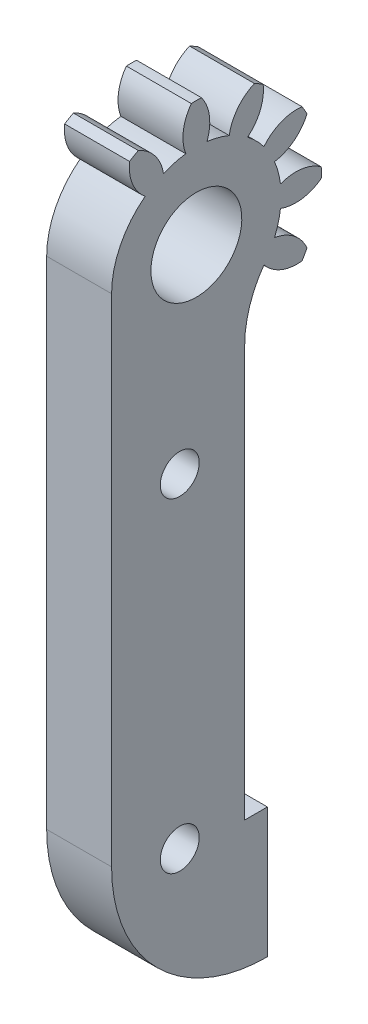
ISO-10303-21;
HEADER;
FILE_DESCRIPTION(('STEP AP214'),'2;1');
FILE_NAME('part.step','',(''),(''),'','','');
FILE_SCHEMA(('AUTOMOTIVE_DESIGN { 1 0 10303 214 1 1 1 1 }'));
ENDSEC;
DATA;
#1=APPLICATION_CONTEXT('core data for automotive mechanical design processes');
#2=APPLICATION_PROTOCOL_DEFINITION('international standard','automotive_design',2000,#1);
#3=PRODUCT_CONTEXT('',#1,'mechanical');
#4=PRODUCT('Part','Part','',(#3));
#5=PRODUCT_RELATED_PRODUCT_CATEGORY('part','',(#4));
#6=PRODUCT_DEFINITION_FORMATION('','',#4);
#7=PRODUCT_DEFINITION_CONTEXT('part definition',#1,'design');
#8=PRODUCT_DEFINITION('design','',#6,#7);
#9=PRODUCT_DEFINITION_SHAPE('','',#8);
#10=(LENGTH_UNIT() NAMED_UNIT(*) SI_UNIT(.MILLI.,.METRE.));
#11=(NAMED_UNIT(*) PLANE_ANGLE_UNIT() SI_UNIT($,.RADIAN.));
#12=(NAMED_UNIT(*) SI_UNIT($,.STERADIAN.) SOLID_ANGLE_UNIT());
#13=UNCERTAINTY_MEASURE_WITH_UNIT(LENGTH_MEASURE(1.E-05),#10,'distance_accuracy_value','');
#14=(GEOMETRIC_REPRESENTATION_CONTEXT(3) GLOBAL_UNCERTAINTY_ASSIGNED_CONTEXT((#13)) GLOBAL_UNIT_ASSIGNED_CONTEXT((#10,
#11,#12)) REPRESENTATION_CONTEXT('',''));
#15=CARTESIAN_POINT('',(0.,0.,0.));
#16=DIRECTION('',(0.,0.,1.));
#17=DIRECTION('',(1.,0.,0.));
#18=AXIS2_PLACEMENT_3D('',#15,#16,#17);
#19=CARTESIAN_POINT('',(2.81611238074447,0.23012666428324,-0.226197755581685));
#20=DIRECTION('',(-1.,0.,0.));
#21=DIRECTION('',(0.,-0.258819045102521,0.965925826289068));
#22=AXIS2_PLACEMENT_3D('',#19,#20,#21);
#23=CYLINDRICAL_SURFACE('',#22,6.53025);
#24=CARTESIAN_POINT('',(-2.18388761925553,0.23012666428324,-0.226197755581685));
#25=DIRECTION('',(-1.,0.,0.));
#26=DIRECTION('',(0.,0.707106781186549,-0.707106781186546));
#27=AXIS2_PLACEMENT_3D('',#24,#25,#26);
#28=CIRCLE('',#27,6.53025);
#29=CARTESIAN_POINT('',(-2.18388761925553,0.230126664283195,6.30405224441832));
#30=VERTEX_POINT('',#29);
#31=CARTESIAN_POINT('',(-2.18388761925553,5.43320069859071,3.71996312000555));
#32=VERTEX_POINT('',#31);
#33=EDGE_CURVE('E250',#30,#32,#28,.T.);
#34=ORIENTED_EDGE('',*,*,#33,.F.);
#35=DIRECTION('',(1.,0.,0.));
#36=VECTOR('',#35,1.);
#37=CARTESIAN_POINT('',(-53.8275283188609,0.230126664283195,6.30405224441832));
#38=LINE('',#37,#36);
#39=CARTESIAN_POINT('',(2.81611238074447,0.230126664283195,6.30405224441832));
#40=VERTEX_POINT('',#39);
#41=EDGE_CURVE('E235',#30,#40,#38,.T.);
#42=ORIENTED_EDGE('',*,*,#41,.T.);
#43=CARTESIAN_POINT('',(2.81611238074447,0.23012666428324,-0.226197755581685));
#44=DIRECTION('',(-1.,0.,0.));
#45=DIRECTION('',(0.,0.707106781186549,-0.707106781186546));
#46=AXIS2_PLACEMENT_3D('',#43,#44,#45);
#47=CIRCLE('',#46,6.53025);
#48=CARTESIAN_POINT('',(2.81611238074447,5.43320069859071,3.71996312000555));
#49=VERTEX_POINT('',#48);
#50=EDGE_CURVE('E248',#40,#49,#47,.T.);
#51=ORIENTED_EDGE('',*,*,#50,.T.);
#52=DIRECTION('',(-1.,0.,0.));
#53=VECTOR('',#52,1.);
#54=CARTESIAN_POINT('',(2.81611238074447,5.43320069859071,3.71996312000555));
#55=LINE('',#54,#53);
#56=EDGE_CURVE('E256',#49,#32,#55,.T.);
#57=ORIENTED_EDGE('',*,*,#56,.T.);
#58=EDGE_LOOP('',(#34,#42,#51,#57));
#59=FACE_BOUND('',#58,.T.);
#60=ADVANCED_FACE('F32',(#59),#23,.T.);
#61=CARTESIAN_POINT('',(2.81611238074447,0.23012666428324,-0.226197755581685));
#62=DIRECTION('',(-1.,0.,0.));
#63=DIRECTION('',(0.,-0.258819045102521,0.965925826289068));
#64=AXIS2_PLACEMENT_3D('',#61,#62,#63);
#65=PLANE('',#64);
#66=CARTESIAN_POINT('',(2.81611238074447,-14.4107973671098,1.05405224441829));
#67=DIRECTION('',(-1.,0.,0.));
#68=DIRECTION('',(0.,0.,1.));
#69=AXIS2_PLACEMENT_3D('',#66,#67,#68);
#70=CIRCLE('',#69,1.50000000000002);
#71=CARTESIAN_POINT('',(2.81611238074447,-14.4107973671098,2.55405224441831));
#72=VERTEX_POINT('',#71);
#73=EDGE_CURVE('E735',#72,#72,#70,.F.);
#74=ORIENTED_EDGE('',*,*,#73,.F.);
#75=EDGE_LOOP('',(#74));
#76=FACE_BOUND('',#75,.T.);
#77=CARTESIAN_POINT('',(2.81611238074447,-39.4107973671098,1.05405224441828));
#78=DIRECTION('',(-1.,0.,0.));
#79=DIRECTION('',(0.,0.,1.));
#80=AXIS2_PLACEMENT_3D('',#77,#78,#79);
#81=CIRCLE('',#80,1.50000000000004);
#82=CARTESIAN_POINT('',(2.81611238074447,-39.4107973671098,2.55405224441831));
#83=VERTEX_POINT('',#82);
#84=EDGE_CURVE('E244',#83,#83,#81,.F.);
#85=ORIENTED_EDGE('',*,*,#84,.F.);
#86=EDGE_LOOP('',(#85));
#87=FACE_BOUND('',#86,.T.);
#88=CARTESIAN_POINT('',(2.81611238074447,0.23012666428324,-0.226197755581685));
#89=DIRECTION('',(-1.,0.,0.));
#90=DIRECTION('',(0.,-0.258819045102521,0.965925826289068));
#91=AXIS2_PLACEMENT_3D('',#88,#89,#90);
#92=CIRCLE('',#91,3.5);
#93=CARTESIAN_POINT('',(2.81611238074447,-0.675739993575585,3.15454263643005));
#94=VERTEX_POINT('',#93);
#95=EDGE_CURVE('E448',#94,#94,#92,.F.);
#96=ORIENTED_EDGE('',*,*,#95,.F.);
#97=EDGE_LOOP('',(#96));
#98=FACE_BOUND('',#97,.T.);
#99=ORIENTED_EDGE('',*,*,#50,.F.);
#100=DIRECTION('',(0.,-1.,0.));
#101=VECTOR('',#100,1.);
#102=CARTESIAN_POINT('',(2.81611238074447,0.230126664283195,6.30405224441832));
#103=LINE('',#102,#101);
#104=CARTESIAN_POINT('',(2.81611238074447,-38.,6.30405224441831));
#105=VERTEX_POINT('',#104);
#106=EDGE_CURVE('E231',#40,#105,#103,.T.);
#107=ORIENTED_EDGE('',*,*,#106,.T.);
#108=CARTESIAN_POINT('',(2.81611238074447,-38.,-5.69594775558169));
#109=DIRECTION('',(1.,0.,0.));
#110=DIRECTION('',(0.,0.,-1.));
#111=AXIS2_PLACEMENT_3D('',#108,#109,#110);
#112=CIRCLE('',#111,12.);
#113=CARTESIAN_POINT('',(2.81611238074447,-50.,-5.69594775558169));
#114=VERTEX_POINT('',#113);
#115=EDGE_CURVE('E243',#105,#114,#112,.T.);
#116=ORIENTED_EDGE('',*,*,#115,.T.);
#117=DIRECTION('',(0.,1.,0.));
#118=VECTOR('',#117,1.);
#119=CARTESIAN_POINT('',(2.81611238074447,-40.,-5.69594775558169));
#120=LINE('',#119,#118);
#121=CARTESIAN_POINT('',(2.81611238074447,-40.,-5.69594775558169));
#122=VERTEX_POINT('',#121);
#123=EDGE_CURVE('E752',#114,#122,#120,.T.);
#124=ORIENTED_EDGE('',*,*,#123,.T.);
#125=DIRECTION('',(0.,0.,1.));
#126=VECTOR('',#125,1.);
#127=CARTESIAN_POINT('',(2.81611238074447,-40.,-3.94594775558169));
#128=LINE('',#127,#126);
#129=CARTESIAN_POINT('',(2.81611238074447,-40.,-3.94594775558169));
#130=VERTEX_POINT('',#129);
#131=EDGE_CURVE('E755',#122,#130,#128,.T.);
#132=ORIENTED_EDGE('',*,*,#131,.T.);
#133=DIRECTION('',(0.,1.,0.));
#134=VECTOR('',#133,1.);
#135=CARTESIAN_POINT('',(2.81611238074447,-40.,-3.94594775558169));
#136=LINE('',#135,#134);
#137=CARTESIAN_POINT('',(2.81611238074447,-8.35639350323014,-3.94594775558169));
#138=VERTEX_POINT('',#137);
#139=EDGE_CURVE('E758',#130,#138,#136,.T.);
#140=ORIENTED_EDGE('',*,*,#139,.T.);
#141=CARTESIAN_POINT('',(2.81611238074447,-8.35639350323014,-11.9459477555817));
#142=DIRECTION('',(-1.,0.,0.));
#143=DIRECTION('',(0.,0.,1.));
#144=AXIS2_PLACEMENT_3D('',#141,#142,#143);
#145=CIRCLE('',#144,8.);
#146=CARTESIAN_POINT('',(2.81611238074447,-3.71603421130395,-5.42927178988919));
#147=VERTEX_POINT('',#146);
#148=EDGE_CURVE('E251',#138,#147,#145,.T.);
#149=ORIENTED_EDGE('',*,*,#148,.T.);
#150=CARTESIAN_POINT('',(2.81611238074447,-1.63710295030858,-7.99209148937183));
#151=DIRECTION('',(-1.,0.,0.));
#152=DIRECTION('',(0.,-0.707106781186554,0.707106781186541));
#153=AXIS2_PLACEMENT_3D('',#150,#151,#152);
#154=CIRCLE('',#153,3.3);
#155=CARTESIAN_POINT('',(2.81611238074447,-4.91657616933773,-8.35959034062256));
#156=VERTEX_POINT('',#155);
#157=EDGE_CURVE('E373',#156,#147,#154,.T.);
#158=ORIENTED_EDGE('',*,*,#157,.F.);
#159=CARTESIAN_POINT('',(2.81611238074447,0.23012666428324,-0.226197755581685));
#160=DIRECTION('',(-1.,0.,0.));
#161=DIRECTION('',(0.,-0.258819045102521,0.965925826289068));
#162=AXIS2_PLACEMENT_3D('',#159,#160,#161);
#163=CIRCLE('',#162,9.625);
#164=CARTESIAN_POINT('',(2.81611238074447,-4.2402465165035,-8.75006944774732));
#165=VERTEX_POINT('',#164);
#166=EDGE_CURVE('E303',#165,#156,#163,.T.);
#167=ORIENTED_EDGE('',*,*,#166,.F.);
#168=CARTESIAN_POINT('',(2.81611238074447,-5.56171978497339,-5.72621290341201));
#169=DIRECTION('',(-1.,0.,0.));
#170=DIRECTION('',(0.,-0.965925826289071,0.258819045102511));
#171=AXIS2_PLACEMENT_3D('',#168,#169,#170);
#172=CIRCLE('',#171,3.3);
#173=CARTESIAN_POINT('',(2.81611238074447,-2.30278718940454,-6.24521033841423));
#174=VERTEX_POINT('',#173);
#175=EDGE_CURVE('E370',#174,#165,#172,.T.);
#176=ORIENTED_EDGE('',*,*,#175,.F.);
#177=CARTESIAN_POINT('',(2.81611238074447,0.23012666428324,-0.226197755581685));
#178=DIRECTION('',(-1.,0.,0.));
#179=DIRECTION('',(0.,-0.965925826289071,0.258819045102511));
#180=AXIS2_PLACEMENT_3D('',#177,#178,#179);
#181=CIRCLE('',#180,6.53025);
#182=CARTESIAN_POINT('',(2.81611238074447,-0.585811884241744,-6.70527248485677));
#183=VERTEX_POINT('',#182);
#184=EDGE_CURVE('E460',#183,#174,#181,.T.);
#185=ORIENTED_EDGE('',*,*,#184,.F.);
#186=CARTESIAN_POINT('',(2.81611238074447,2.49600525024317,-7.88527381943024));
#187=DIRECTION('',(-1.,0.,0.));
#188=DIRECTION('',(0.,-0.965925826289071,0.258819045102511));
#189=AXIS2_PLACEMENT_3D('',#186,#187,#188);
#190=CIRCLE('',#189,3.3);
#191=CARTESIAN_POINT('',(2.81611238074447,-0.160352442841428,-9.84327376998955));
#192=VERTEX_POINT('',#191);
#193=EDGE_CURVE('E457',#192,#183,#190,.T.);
#194=ORIENTED_EDGE('',*,*,#193,.F.);
#195=CARTESIAN_POINT('',(2.81611238074447,0.62060577140811,-9.84327376998955));
#196=VERTEX_POINT('',#195);
#197=EDGE_CURVE('E374',#196,#192,#163,.T.);
#198=ORIENTED_EDGE('',*,*,#197,.F.);
#199=CARTESIAN_POINT('',(2.81611238074447,-2.03575192167653,-7.88527381943029));
#200=DIRECTION('',(-1.,0.,0.));
#201=DIRECTION('',(0.,-0.965925826289065,-0.258819045102531));
#202=AXIS2_PLACEMENT_3D('',#199,#200,#201);
#203=CIRCLE('',#202,3.3);
#204=CARTESIAN_POINT('',(2.81611238074447,1.04606521280836,-6.70527248485675));
#205=VERTEX_POINT('',#204);
#206=EDGE_CURVE('E471',#205,#196,#203,.T.);
#207=ORIENTED_EDGE('',*,*,#206,.F.);
#208=CARTESIAN_POINT('',(2.81611238074447,0.23012666428324,-0.226197755581685));
#209=DIRECTION('',(-1.,0.,0.));
#210=DIRECTION('',(0.,-0.965925826289065,-0.258819045102531));
#211=AXIS2_PLACEMENT_3D('',#208,#209,#210);
#212=CIRCLE('',#211,6.53025);
#213=CARTESIAN_POINT('',(2.81611238074447,2.76304051797115,-6.24521033841418));
#214=VERTEX_POINT('',#213);
#215=EDGE_CURVE('E476',#214,#205,#212,.T.);
#216=ORIENTED_EDGE('',*,*,#215,.F.);
#217=CARTESIAN_POINT('',(2.81611238074447,6.02197311353999,-5.72621290341189));
#218=DIRECTION('',(-1.,0.,0.));
#219=DIRECTION('',(0.,-0.965925826289065,-0.258819045102531));
#220=AXIS2_PLACEMENT_3D('',#217,#218,#219);
#221=CIRCLE('',#220,3.3);
#222=CARTESIAN_POINT('',(2.81611238074447,4.70049984507016,-8.75006944774723));
#223=VERTEX_POINT('',#222);
#224=EDGE_CURVE('E473',#223,#214,#221,.T.);
#225=ORIENTED_EDGE('',*,*,#224,.F.);
#226=CARTESIAN_POINT('',(2.81611238074447,5.37682949790438,-8.35959034062245));
#227=VERTEX_POINT('',#226);
#228=EDGE_CURVE('E358',#227,#223,#163,.T.);
#229=ORIENTED_EDGE('',*,*,#228,.F.);
#230=CARTESIAN_POINT('',(2.81611238074447,2.09735627887523,-7.99209148937179));
#231=DIRECTION('',(-1.,0.,0.));
#232=DIRECTION('',(0.,-0.707106781186539,-0.707106781186556));
#233=AXIS2_PLACEMENT_3D('',#230,#231,#232);
#234=CIRCLE('',#233,3.3);
#235=CARTESIAN_POINT('',(2.81611238074447,4.17628753987054,-5.42927178988911));
#236=VERTEX_POINT('',#235);
#237=EDGE_CURVE('E396',#236,#227,#234,.T.);
#238=ORIENTED_EDGE('',*,*,#237,.F.);
#239=CARTESIAN_POINT('',(2.81611238074447,0.23012666428324,-0.226197755581685));
#240=DIRECTION('',(-1.,0.,0.));
#241=DIRECTION('',(0.,-0.707106781186539,-0.707106781186556));
#242=AXIS2_PLACEMENT_3D('',#239,#240,#241);
#243=CIRCLE('',#242,6.53025);
#244=CARTESIAN_POINT('',(2.81611238074447,5.43320069859076,-4.17235863116885));
#245=VERTEX_POINT('',#244);
#246=EDGE_CURVE('E393',#245,#236,#243,.T.);
#247=ORIENTED_EDGE('',*,*,#246,.F.);
#248=CARTESIAN_POINT('',(2.81611238074447,7.99602039807339,-2.09342737017348));
#249=DIRECTION('',(-1.,0.,0.));
#250=DIRECTION('',(0.,-0.707106781186539,-0.707106781186556));
#251=AXIS2_PLACEMENT_3D('',#248,#249,#250);
#252=CIRCLE('',#251,3.3);
#253=CARTESIAN_POINT('',(2.81611238074447,8.36351924932413,-5.37290058920263));
#254=VERTEX_POINT('',#253);
#255=EDGE_CURVE('E391',#254,#245,#252,.T.);
#256=ORIENTED_EDGE('',*,*,#255,.F.);
#257=CARTESIAN_POINT('',(2.81611238074447,8.75399835644889,-4.69657093636839));
#258=VERTEX_POINT('',#257);
#259=EDGE_CURVE('E302',#258,#254,#163,.T.);
#260=ORIENTED_EDGE('',*,*,#259,.F.);
#261=CARTESIAN_POINT('',(2.81611238074447,5.73014181211358,-6.0180442048383));
#262=DIRECTION('',(-1.,0.,0.));
#263=DIRECTION('',(0.,-0.258819045102508,-0.965925826289072));
#264=AXIS2_PLACEMENT_3D('',#261,#262,#263);
#265=CIRCLE('',#264,3.3);
#266=CARTESIAN_POINT('',(2.81611238074447,6.2491392471158,-2.75911160926945));
#267=VERTEX_POINT('',#266);
#268=EDGE_CURVE('E389',#267,#258,#265,.T.);
#269=ORIENTED_EDGE('',*,*,#268,.F.);
#270=CARTESIAN_POINT('',(2.81611238074447,0.23012666428324,-0.226197755581685));
#271=DIRECTION('',(-1.,0.,0.));
#272=DIRECTION('',(0.,-0.258819045102508,-0.965925826289072));
#273=AXIS2_PLACEMENT_3D('',#270,#271,#272);
#274=CIRCLE('',#273,6.53025);
#275=CARTESIAN_POINT('',(2.81611238074447,6.70920139355833,-1.04213630410665));
#276=VERTEX_POINT('',#275);
#277=EDGE_CURVE('E423',#276,#267,#274,.T.);
#278=ORIENTED_EDGE('',*,*,#277,.F.);
#279=CARTESIAN_POINT('',(2.81611238074447,7.88920272813179,2.03968083037828));
#280=DIRECTION('',(-1.,0.,0.));
#281=DIRECTION('',(0.,-0.258819045102508,-0.965925826289072));
#282=AXIS2_PLACEMENT_3D('',#279,#280,#281);
#283=CIRCLE('',#282,3.3);
#284=CARTESIAN_POINT('',(2.81611238074447,9.84720267869111,-0.616676862706319));
#285=VERTEX_POINT('',#284);
#286=EDGE_CURVE('E416',#285,#276,#283,.T.);
#287=ORIENTED_EDGE('',*,*,#286,.F.);
#288=CARTESIAN_POINT('',(2.81611238074447,9.8472026786911,0.164281351543084));
#289=VERTEX_POINT('',#288);
#290=EDGE_CURVE('E298',#289,#285,#163,.T.);
#291=ORIENTED_EDGE('',*,*,#290,.F.);
#292=CARTESIAN_POINT('',(2.81611238074447,7.88920272813182,-2.49207634154154));
#293=DIRECTION('',(-1.,0.,0.));
#294=DIRECTION('',(0.,0.258819045102521,-0.965925826289068));
#295=AXIS2_PLACEMENT_3D('',#292,#293,#294);
#296=CIRCLE('',#295,3.3);
#297=CARTESIAN_POINT('',(2.81611238074447,6.70920139355831,0.589740792943367));
#298=VERTEX_POINT('',#297);
#299=EDGE_CURVE('E270',#298,#289,#296,.T.);
#300=ORIENTED_EDGE('',*,*,#299,.F.);
#301=CARTESIAN_POINT('',(2.81611238074447,0.23012666428324,-0.226197755581685));
#302=DIRECTION('',(-1.,0.,0.));
#303=DIRECTION('',(0.,0.258819045102521,-0.965925826289068));
#304=AXIS2_PLACEMENT_3D('',#301,#302,#303);
#305=CIRCLE('',#304,6.53025);
#306=CARTESIAN_POINT('',(2.81611238074447,6.24913924711576,2.30671609810616));
#307=VERTEX_POINT('',#306);
#308=EDGE_CURVE('E275',#307,#298,#305,.T.);
#309=ORIENTED_EDGE('',*,*,#308,.F.);
#310=CARTESIAN_POINT('',(2.81611238074447,5.7301418121135,5.56564869367501));
#311=DIRECTION('',(-1.,0.,0.));
#312=DIRECTION('',(0.,0.258819045102521,-0.965925826289068));
#313=AXIS2_PLACEMENT_3D('',#310,#311,#312);
#314=CIRCLE('',#313,3.3);
#315=CARTESIAN_POINT('',(2.81611238074447,8.75399835644883,4.24417542520514));
#316=VERTEX_POINT('',#315);
#317=EDGE_CURVE('E272',#316,#307,#314,.T.);
#318=ORIENTED_EDGE('',*,*,#317,.F.);
#319=CARTESIAN_POINT('',(2.81611238074447,8.36351924932406,4.92050507803937));
#320=VERTEX_POINT('',#319);
#321=EDGE_CURVE('E295',#320,#316,#163,.T.);
#322=ORIENTED_EDGE('',*,*,#321,.F.);
#323=CARTESIAN_POINT('',(2.81611238074447,7.99602039807336,1.64103185901022));
#324=DIRECTION('',(-1.,0.,0.));
#325=DIRECTION('',(0.,0.707106781186549,-0.707106781186546));
#326=AXIS2_PLACEMENT_3D('',#323,#324,#325);
#327=CIRCLE('',#326,3.3);
#328=EDGE_CURVE('E255',#49,#320,#327,.T.);
#329=ORIENTED_EDGE('',*,*,#328,.F.);
#330=EDGE_LOOP('',(#99,#107,#116,#124,#132,#140,#149,#158,#167,#176,#185,#194,#198,#207,#216,
#225,#229,#238,#247,#256,#260,#269,#278,#287,#291,#300,#309,#318,#322,#329));
#331=FACE_BOUND('',#330,.T.);
#332=ADVANCED_FACE('F34',(#76,#87,#98,#331),#65,.F.);
#333=CARTESIAN_POINT('',(-2.18388761925553,0.23012666428324,-0.226197755581685));
#334=DIRECTION('',(1.,0.,0.));
#335=DIRECTION('',(0.,0.258819045102521,-0.965925826289068));
#336=AXIS2_PLACEMENT_3D('',#333,#334,#335);
#337=PLANE('',#336);
#338=CARTESIAN_POINT('',(-2.18388761925553,-14.4107973671098,1.05405224441829));
#339=DIRECTION('',(-1.,0.,0.));
#340=DIRECTION('',(0.,0.,1.));
#341=AXIS2_PLACEMENT_3D('',#338,#339,#340);
#342=CIRCLE('',#341,1.50000000000002);
#343=CARTESIAN_POINT('',(-2.18388761925553,-14.4107973671098,2.55405224441831));
#344=VERTEX_POINT('',#343);
#345=EDGE_CURVE('E732',#344,#344,#342,.T.);
#346=ORIENTED_EDGE('',*,*,#345,.F.);
#347=EDGE_LOOP('',(#346));
#348=FACE_BOUND('',#347,.T.);
#349=CARTESIAN_POINT('',(-2.18388761925553,-39.4107973671098,1.05405224441828));
#350=DIRECTION('',(-1.,0.,0.));
#351=DIRECTION('',(0.,0.,1.));
#352=AXIS2_PLACEMENT_3D('',#349,#350,#351);
#353=CIRCLE('',#352,1.50000000000004);
#354=CARTESIAN_POINT('',(-2.18388761925553,-39.4107973671098,2.55405224441831));
#355=VERTEX_POINT('',#354);
#356=EDGE_CURVE('E737',#355,#355,#353,.T.);
#357=ORIENTED_EDGE('',*,*,#356,.F.);
#358=EDGE_LOOP('',(#357));
#359=FACE_BOUND('',#358,.T.);
#360=CARTESIAN_POINT('',(-2.18388761925553,0.23012666428324,-0.226197755581685));
#361=DIRECTION('',(1.,0.,0.));
#362=DIRECTION('',(0.,0.258819045102521,-0.965925826289068));
#363=AXIS2_PLACEMENT_3D('',#360,#361,#362);
#364=CIRCLE('',#363,3.5);
#365=CARTESIAN_POINT('',(-2.18388761925553,1.13599332214207,-3.60693814759342));
#366=VERTEX_POINT('',#365);
#367=EDGE_CURVE('E36',#366,#366,#364,.F.);
#368=ORIENTED_EDGE('',*,*,#367,.F.);
#369=EDGE_LOOP('',(#368));
#370=FACE_BOUND('',#369,.T.);
#371=CARTESIAN_POINT('',(-2.18388761925553,-1.63710295030858,-7.99209148937183));
#372=DIRECTION('',(1.,0.,0.));
#373=DIRECTION('',(0.,0.258819045102521,-0.965925826289068));
#374=AXIS2_PLACEMENT_3D('',#371,#372,#373);
#375=CIRCLE('',#374,3.3);
#376=CARTESIAN_POINT('',(-2.18388761925553,-3.71603421130395,-5.42927178988919));
#377=VERTEX_POINT('',#376);
#378=CARTESIAN_POINT('',(-2.18388761925553,-4.91657616933773,-8.35959034062256));
#379=VERTEX_POINT('',#378);
#380=EDGE_CURVE('E41',#377,#379,#375,.T.);
#381=ORIENTED_EDGE('',*,*,#380,.F.);
#382=CARTESIAN_POINT('',(-2.18388761925553,-8.35639350323014,-11.9459477555817));
#383=DIRECTION('',(1.,0.,0.));
#384=DIRECTION('',(0.,0.,-1.));
#385=AXIS2_PLACEMENT_3D('',#382,#383,#384);
#386=CIRCLE('',#385,8.);
#387=CARTESIAN_POINT('',(-2.18388761925553,-8.35639350323014,-3.94594775558169));
#388=VERTEX_POINT('',#387);
#389=EDGE_CURVE('E445',#377,#388,#386,.T.);
#390=ORIENTED_EDGE('',*,*,#389,.T.);
#391=DIRECTION('',(0.,-1.,0.));
#392=VECTOR('',#391,1.);
#393=CARTESIAN_POINT('',(-2.18388761925553,-40.,-3.94594775558169));
#394=LINE('',#393,#392);
#395=CARTESIAN_POINT('',(-2.18388761925553,-40.,-3.94594775558169));
#396=VERTEX_POINT('',#395);
#397=EDGE_CURVE('E449',#388,#396,#394,.T.);
#398=ORIENTED_EDGE('',*,*,#397,.T.);
#399=DIRECTION('',(0.,0.,-1.));
#400=VECTOR('',#399,1.);
#401=CARTESIAN_POINT('',(-2.18388761925553,-40.,-3.94594775558169));
#402=LINE('',#401,#400);
#403=CARTESIAN_POINT('',(-2.18388761925553,-40.,-5.69594775558169));
#404=VERTEX_POINT('',#403);
#405=EDGE_CURVE('E748',#396,#404,#402,.T.);
#406=ORIENTED_EDGE('',*,*,#405,.T.);
#407=DIRECTION('',(0.,-1.,0.));
#408=VECTOR('',#407,1.);
#409=CARTESIAN_POINT('',(-2.18388761925553,-40.,-5.69594775558169));
#410=LINE('',#409,#408);
#411=CARTESIAN_POINT('',(-2.18388761925553,-50.,-5.69594775558169));
#412=VERTEX_POINT('',#411);
#413=EDGE_CURVE('E745',#404,#412,#410,.T.);
#414=ORIENTED_EDGE('',*,*,#413,.T.);
#415=CARTESIAN_POINT('',(-2.18388761925553,-38.,-5.69594775558169));
#416=DIRECTION('',(1.,0.,0.));
#417=DIRECTION('',(0.,0.,-1.));
#418=AXIS2_PLACEMENT_3D('',#415,#416,#417);
#419=CIRCLE('',#418,12.);
#420=CARTESIAN_POINT('',(-2.18388761925553,-38.,6.30405224441831));
#421=VERTEX_POINT('',#420);
#422=EDGE_CURVE('E444',#412,#421,#419,.F.);
#423=ORIENTED_EDGE('',*,*,#422,.T.);
#424=DIRECTION('',(0.,1.,0.));
#425=VECTOR('',#424,1.);
#426=CARTESIAN_POINT('',(-2.18388761925553,0.230126664283195,6.30405224441832));
#427=LINE('',#426,#425);
#428=EDGE_CURVE('E442',#421,#30,#427,.T.);
#429=ORIENTED_EDGE('',*,*,#428,.T.);
#430=ORIENTED_EDGE('',*,*,#33,.T.);
#431=CARTESIAN_POINT('',(-2.18388761925553,7.99602039807336,1.64103185901022));
#432=DIRECTION('',(-1.,0.,0.));
#433=DIRECTION('',(0.,0.707106781186549,-0.707106781186546));
#434=AXIS2_PLACEMENT_3D('',#431,#432,#433);
#435=CIRCLE('',#434,3.3);
#436=CARTESIAN_POINT('',(-2.18388761925553,8.36351924932406,4.92050507803937));
#437=VERTEX_POINT('',#436);
#438=EDGE_CURVE('E263',#32,#437,#435,.T.);
#439=ORIENTED_EDGE('',*,*,#438,.T.);
#440=CARTESIAN_POINT('',(-2.18388761925553,0.23012666428324,-0.226197755581685));
#441=DIRECTION('',(-1.,0.,0.));
#442=DIRECTION('',(0.,-0.258819045102521,0.965925826289068));
#443=AXIS2_PLACEMENT_3D('',#440,#441,#442);
#444=CIRCLE('',#443,9.625);
#445=CARTESIAN_POINT('',(-2.18388761925553,8.75399835644883,4.24417542520514));
#446=VERTEX_POINT('',#445);
#447=EDGE_CURVE('E291',#437,#446,#444,.T.);
#448=ORIENTED_EDGE('',*,*,#447,.T.);
#449=CARTESIAN_POINT('',(-2.18388761925553,5.7301418121135,5.56564869367501));
#450=DIRECTION('',(1.,0.,0.));
#451=DIRECTION('',(0.,0.258819045102521,-0.965925826289068));
#452=AXIS2_PLACEMENT_3D('',#449,#450,#451);
#453=CIRCLE('',#452,3.3);
#454=CARTESIAN_POINT('',(-2.18388761925553,6.24913924711576,2.30671609810616));
#455=VERTEX_POINT('',#454);
#456=EDGE_CURVE('E301',#455,#446,#453,.T.);
#457=ORIENTED_EDGE('',*,*,#456,.F.);
#458=CARTESIAN_POINT('',(-2.18388761925553,0.23012666428324,-0.226197755581685));
#459=DIRECTION('',(-1.,0.,0.));
#460=DIRECTION('',(0.,0.258819045102521,-0.965925826289068));
#461=AXIS2_PLACEMENT_3D('',#458,#459,#460);
#462=CIRCLE('',#461,6.53025);
#463=CARTESIAN_POINT('',(-2.18388761925553,6.70920139355831,0.589740792943367));
#464=VERTEX_POINT('',#463);
#465=EDGE_CURVE('E273',#455,#464,#462,.T.);
#466=ORIENTED_EDGE('',*,*,#465,.T.);
#467=CARTESIAN_POINT('',(-2.18388761925553,7.88920272813182,-2.49207634154154));
#468=DIRECTION('',(-1.,0.,0.));
#469=DIRECTION('',(0.,0.258819045102521,-0.965925826289068));
#470=AXIS2_PLACEMENT_3D('',#467,#468,#469);
#471=CIRCLE('',#470,3.3);
#472=CARTESIAN_POINT('',(-2.18388761925553,9.8472026786911,0.164281351543084));
#473=VERTEX_POINT('',#472);
#474=EDGE_CURVE('E269',#464,#473,#471,.T.);
#475=ORIENTED_EDGE('',*,*,#474,.T.);
#476=CARTESIAN_POINT('',(-2.18388761925553,9.84720267869111,-0.616676862706319));
#477=VERTEX_POINT('',#476);
#478=EDGE_CURVE('E292',#473,#477,#444,.T.);
#479=ORIENTED_EDGE('',*,*,#478,.T.);
#480=CARTESIAN_POINT('',(-2.18388761925553,7.88920272813179,2.03968083037828));
#481=DIRECTION('',(1.,0.,0.));
#482=DIRECTION('',(0.,0.258819045102521,-0.965925826289068));
#483=AXIS2_PLACEMENT_3D('',#480,#481,#482);
#484=CIRCLE('',#483,3.3);
#485=CARTESIAN_POINT('',(-2.18388761925553,6.70920139355833,-1.04213630410665));
#486=VERTEX_POINT('',#485);
#487=EDGE_CURVE('E308',#486,#477,#484,.T.);
#488=ORIENTED_EDGE('',*,*,#487,.F.);
#489=CARTESIAN_POINT('',(-2.18388761925553,0.23012666428324,-0.226197755581685));
#490=DIRECTION('',(-1.,0.,0.));
#491=DIRECTION('',(0.,-0.258819045102508,-0.965925826289072));
#492=AXIS2_PLACEMENT_3D('',#489,#490,#491);
#493=CIRCLE('',#492,6.53025);
#494=CARTESIAN_POINT('',(-2.18388761925553,6.2491392471158,-2.75911160926945));
#495=VERTEX_POINT('',#494);
#496=EDGE_CURVE('E483',#486,#495,#493,.T.);
#497=ORIENTED_EDGE('',*,*,#496,.T.);
#498=CARTESIAN_POINT('',(-2.18388761925553,5.73014181211358,-6.0180442048383));
#499=DIRECTION('',(-1.,0.,0.));
#500=DIRECTION('',(0.,-0.258819045102508,-0.965925826289072));
#501=AXIS2_PLACEMENT_3D('',#498,#499,#500);
#502=CIRCLE('',#501,3.3);
#503=CARTESIAN_POINT('',(-2.18388761925553,8.75399835644889,-4.69657093636839));
#504=VERTEX_POINT('',#503);
#505=EDGE_CURVE('E455',#495,#504,#502,.T.);
#506=ORIENTED_EDGE('',*,*,#505,.T.);
#507=CARTESIAN_POINT('',(-2.18388761925553,8.36351924932413,-5.37290058920263));
#508=VERTEX_POINT('',#507);
#509=EDGE_CURVE('E296',#504,#508,#444,.T.);
#510=ORIENTED_EDGE('',*,*,#509,.T.);
#511=CARTESIAN_POINT('',(-2.18388761925553,7.99602039807339,-2.09342737017348));
#512=DIRECTION('',(1.,0.,0.));
#513=DIRECTION('',(0.,0.258819045102521,-0.965925826289068));
#514=AXIS2_PLACEMENT_3D('',#511,#512,#513);
#515=CIRCLE('',#514,3.3);
#516=CARTESIAN_POINT('',(-2.18388761925553,5.43320069859076,-4.17235863116885));
#517=VERTEX_POINT('',#516);
#518=EDGE_CURVE('E306',#517,#508,#515,.T.);
#519=ORIENTED_EDGE('',*,*,#518,.F.);
#520=CARTESIAN_POINT('',(-2.18388761925553,0.23012666428324,-0.226197755581685));
#521=DIRECTION('',(-1.,0.,0.));
#522=DIRECTION('',(0.,-0.707106781186539,-0.707106781186556));
#523=AXIS2_PLACEMENT_3D('',#520,#521,#522);
#524=CIRCLE('',#523,6.53025);
#525=CARTESIAN_POINT('',(-2.18388761925553,4.17628753987054,-5.42927178988911));
#526=VERTEX_POINT('',#525);
#527=EDGE_CURVE('E400',#517,#526,#524,.T.);
#528=ORIENTED_EDGE('',*,*,#527,.T.);
#529=CARTESIAN_POINT('',(-2.18388761925553,2.09735627887523,-7.99209148937179));
#530=DIRECTION('',(-1.,0.,0.));
#531=DIRECTION('',(0.,-0.707106781186539,-0.707106781186556));
#532=AXIS2_PLACEMENT_3D('',#529,#530,#531);
#533=CIRCLE('',#532,3.3);
#534=CARTESIAN_POINT('',(-2.18388761925553,5.37682949790438,-8.35959034062245));
#535=VERTEX_POINT('',#534);
#536=EDGE_CURVE('E349',#526,#535,#533,.T.);
#537=ORIENTED_EDGE('',*,*,#536,.T.);
#538=CARTESIAN_POINT('',(-2.18388761925553,4.70049984507016,-8.75006944774723));
#539=VERTEX_POINT('',#538);
#540=EDGE_CURVE('E336',#535,#539,#444,.T.);
#541=ORIENTED_EDGE('',*,*,#540,.T.);
#542=CARTESIAN_POINT('',(-2.18388761925553,6.02197311353999,-5.72621290341189));
#543=DIRECTION('',(1.,0.,0.));
#544=DIRECTION('',(0.,0.258819045102521,-0.965925826289068));
#545=AXIS2_PLACEMENT_3D('',#542,#543,#544);
#546=CIRCLE('',#545,3.3);
#547=CARTESIAN_POINT('',(-2.18388761925553,2.76304051797115,-6.24521033841418));
#548=VERTEX_POINT('',#547);
#549=EDGE_CURVE('E310',#548,#539,#546,.T.);
#550=ORIENTED_EDGE('',*,*,#549,.F.);
#551=CARTESIAN_POINT('',(-2.18388761925553,0.23012666428324,-0.226197755581685));
#552=DIRECTION('',(-1.,0.,0.));
#553=DIRECTION('',(0.,-0.965925826289065,-0.258819045102531));
#554=AXIS2_PLACEMENT_3D('',#551,#552,#553);
#555=CIRCLE('',#554,6.53025);
#556=CARTESIAN_POINT('',(-2.18388761925553,1.04606521280836,-6.70527248485675));
#557=VERTEX_POINT('',#556);
#558=EDGE_CURVE('E474',#548,#557,#555,.T.);
#559=ORIENTED_EDGE('',*,*,#558,.T.);
#560=CARTESIAN_POINT('',(-2.18388761925553,-2.03575192167653,-7.88527381943029));
#561=DIRECTION('',(-1.,0.,0.));
#562=DIRECTION('',(0.,-0.965925826289065,-0.258819045102531));
#563=AXIS2_PLACEMENT_3D('',#560,#561,#562);
#564=CIRCLE('',#563,3.3);
#565=CARTESIAN_POINT('',(-2.18388761925553,0.620605771408109,-9.84327376998955));
#566=VERTEX_POINT('',#565);
#567=EDGE_CURVE('E56',#557,#566,#564,.T.);
#568=ORIENTED_EDGE('',*,*,#567,.T.);
#569=CARTESIAN_POINT('',(-2.18388761925553,-0.160352442841428,-9.84327376998955));
#570=VERTEX_POINT('',#569);
#571=EDGE_CURVE('E334',#566,#570,#444,.T.);
#572=ORIENTED_EDGE('',*,*,#571,.T.);
#573=CARTESIAN_POINT('',(-2.18388761925553,2.49600525024317,-7.88527381943024));
#574=DIRECTION('',(1.,0.,0.));
#575=DIRECTION('',(0.,0.258819045102521,-0.965925826289068));
#576=AXIS2_PLACEMENT_3D('',#573,#574,#575);
#577=CIRCLE('',#576,3.3);
#578=CARTESIAN_POINT('',(-2.18388761925553,-0.585811884241744,-6.70527248485677));
#579=VERTEX_POINT('',#578);
#580=EDGE_CURVE('E11',#579,#570,#577,.T.);
#581=ORIENTED_EDGE('',*,*,#580,.F.);
#582=CARTESIAN_POINT('',(-2.18388761925553,0.23012666428324,-0.226197755581685));
#583=DIRECTION('',(-1.,0.,0.));
#584=DIRECTION('',(0.,-0.965925826289071,0.258819045102511));
#585=AXIS2_PLACEMENT_3D('',#582,#583,#584);
#586=CIRCLE('',#585,6.53025);
#587=CARTESIAN_POINT('',(-2.18388761925553,-2.30278718940454,-6.24521033841423));
#588=VERTEX_POINT('',#587);
#589=EDGE_CURVE('E458',#579,#588,#586,.T.);
#590=ORIENTED_EDGE('',*,*,#589,.T.);
#591=CARTESIAN_POINT('',(-2.18388761925553,-5.56171978497339,-5.72621290341201));
#592=DIRECTION('',(-1.,0.,0.));
#593=DIRECTION('',(0.,-0.965925826289071,0.258819045102511));
#594=AXIS2_PLACEMENT_3D('',#591,#592,#593);
#595=CIRCLE('',#594,3.3);
#596=CARTESIAN_POINT('',(-2.18388761925553,-4.2402465165035,-8.75006944774732));
#597=VERTEX_POINT('',#596);
#598=EDGE_CURVE('E48',#588,#597,#595,.T.);
#599=ORIENTED_EDGE('',*,*,#598,.T.);
#600=EDGE_CURVE('E297',#597,#379,#444,.T.);
#601=ORIENTED_EDGE('',*,*,#600,.T.);
#602=EDGE_LOOP('',(#381,#390,#398,#406,#414,#423,#429,#430,#439,#448,#457,#466,#475,#479,#488,
#497,#506,#510,#519,#528,#537,#541,#550,#559,#568,#572,#581,#590,#599,#601));
#603=FACE_BOUND('',#602,.T.);
#604=ADVANCED_FACE('F332',(#348,#359,#370,#603),#337,.F.);
#605=CARTESIAN_POINT('',(-12.1838876192555,0.23012666428324,-0.226197755581685));
#606=DIRECTION('',(-1.,0.,0.));
#607=DIRECTION('',(0.,-0.258819045102521,0.965925826289068));
#608=AXIS2_PLACEMENT_3D('',#605,#606,#607);
#609=CYLINDRICAL_SURFACE('',#608,9.625);
#610=DIRECTION('',(-1.,0.,0.));
#611=VECTOR('',#610,1.);
#612=CARTESIAN_POINT('',(0.316112380744471,-4.2402465165035,-8.75006944774732));
#613=LINE('',#612,#611);
#614=EDGE_CURVE('E266',#165,#597,#613,.T.);
#615=ORIENTED_EDGE('',*,*,#614,.F.);
#616=ORIENTED_EDGE('',*,*,#166,.T.);
#617=DIRECTION('',(-1.,0.,0.));
#618=VECTOR('',#617,1.);
#619=CARTESIAN_POINT('',(0.316112380744471,-4.91657616933773,-8.35959034062256));
#620=LINE('',#619,#618);
#621=EDGE_CURVE('E318',#379,#156,#620,.F.);
#622=ORIENTED_EDGE('',*,*,#621,.F.);
#623=ORIENTED_EDGE('',*,*,#600,.F.);
#624=EDGE_LOOP('',(#615,#616,#622,#623));
#625=FACE_BOUND('',#624,.T.);
#626=ADVANCED_FACE('F327',(#625),#609,.T.);
#627=DIRECTION('',(-1.,0.,0.));
#628=VECTOR('',#627,1.);
#629=CARTESIAN_POINT('',(0.316112380744471,-0.160352442841428,-9.84327376998955));
#630=LINE('',#629,#628);
#631=EDGE_CURVE('E329',#570,#192,#630,.F.);
#632=ORIENTED_EDGE('',*,*,#631,.F.);
#633=ORIENTED_EDGE('',*,*,#571,.F.);
#634=DIRECTION('',(-1.,0.,0.));
#635=VECTOR('',#634,1.);
#636=CARTESIAN_POINT('',(0.316112380744471,0.620605771408109,-9.84327376998955));
#637=LINE('',#636,#635);
#638=EDGE_CURVE('E330',#196,#566,#637,.T.);
#639=ORIENTED_EDGE('',*,*,#638,.F.);
#640=ORIENTED_EDGE('',*,*,#197,.T.);
#641=EDGE_LOOP('',(#632,#633,#639,#640));
#642=FACE_BOUND('',#641,.T.);
#643=ADVANCED_FACE('F533',(#642),#609,.T.);
#644=DIRECTION('',(-1.,0.,0.));
#645=VECTOR('',#644,1.);
#646=CARTESIAN_POINT('',(0.316112380744471,4.70049984507016,-8.75006944774723));
#647=LINE('',#646,#645);
#648=EDGE_CURVE('E357',#539,#223,#647,.F.);
#649=ORIENTED_EDGE('',*,*,#648,.F.);
#650=ORIENTED_EDGE('',*,*,#540,.F.);
#651=DIRECTION('',(-1.,0.,0.));
#652=VECTOR('',#651,1.);
#653=CARTESIAN_POINT('',(0.316112380744471,5.37682949790438,-8.35959034062245));
#654=LINE('',#653,#652);
#655=EDGE_CURVE('E355',#227,#535,#654,.T.);
#656=ORIENTED_EDGE('',*,*,#655,.F.);
#657=ORIENTED_EDGE('',*,*,#228,.T.);
#658=EDGE_LOOP('',(#649,#650,#656,#657));
#659=FACE_BOUND('',#658,.T.);
#660=ADVANCED_FACE('F353',(#659),#609,.T.);
#661=DIRECTION('',(-1.,0.,0.));
#662=VECTOR('',#661,1.);
#663=CARTESIAN_POINT('',(0.316112380744471,8.75399835644889,-4.69657093636839));
#664=LINE('',#663,#662);
#665=EDGE_CURVE('E361',#258,#504,#664,.T.);
#666=ORIENTED_EDGE('',*,*,#665,.F.);
#667=ORIENTED_EDGE('',*,*,#259,.T.);
#668=DIRECTION('',(-1.,0.,0.));
#669=VECTOR('',#668,1.);
#670=CARTESIAN_POINT('',(0.316112380744471,8.36351924932413,-5.37290058920263));
#671=LINE('',#670,#669);
#672=EDGE_CURVE('E385',#508,#254,#671,.F.);
#673=ORIENTED_EDGE('',*,*,#672,.F.);
#674=ORIENTED_EDGE('',*,*,#509,.F.);
#675=EDGE_LOOP('',(#666,#667,#673,#674));
#676=FACE_BOUND('',#675,.T.);
#677=ADVANCED_FACE('F384',(#676),#609,.T.);
#678=DIRECTION('',(-1.,0.,0.));
#679=VECTOR('',#678,1.);
#680=CARTESIAN_POINT('',(0.316112380744471,9.84720267869111,-0.616676862706319));
#681=LINE('',#680,#679);
#682=EDGE_CURVE('E364',#477,#285,#681,.F.);
#683=ORIENTED_EDGE('',*,*,#682,.F.);
#684=ORIENTED_EDGE('',*,*,#478,.F.);
#685=DIRECTION('',(-1.,0.,0.));
#686=VECTOR('',#685,1.);
#687=CARTESIAN_POINT('',(0.316112380744471,9.8472026786911,0.164281351543084));
#688=LINE('',#687,#686);
#689=EDGE_CURVE('E289',#289,#473,#688,.T.);
#690=ORIENTED_EDGE('',*,*,#689,.F.);
#691=ORIENTED_EDGE('',*,*,#290,.T.);
#692=EDGE_LOOP('',(#683,#684,#690,#691));
#693=FACE_BOUND('',#692,.T.);
#694=ADVANCED_FACE('F426',(#693),#609,.T.);
#695=DIRECTION('',(-1.,0.,0.));
#696=VECTOR('',#695,1.);
#697=CARTESIAN_POINT('',(0.316112380744471,8.36351924932406,4.92050507803937));
#698=LINE('',#697,#696);
#699=EDGE_CURVE('E258',#320,#437,#698,.T.);
#700=ORIENTED_EDGE('',*,*,#699,.F.);
#701=ORIENTED_EDGE('',*,*,#321,.T.);
#702=DIRECTION('',(-1.,0.,0.));
#703=VECTOR('',#702,1.);
#704=CARTESIAN_POINT('',(0.316112380744471,8.75399835644883,4.24417542520514));
#705=LINE('',#704,#703);
#706=EDGE_CURVE('E286',#446,#316,#705,.F.);
#707=ORIENTED_EDGE('',*,*,#706,.F.);
#708=ORIENTED_EDGE('',*,*,#447,.F.);
#709=EDGE_LOOP('',(#700,#701,#707,#708));
#710=FACE_BOUND('',#709,.T.);
#711=ADVANCED_FACE('F438',(#710),#609,.T.);
#712=CARTESIAN_POINT('',(2.81611238074447,7.88920272813182,-2.49207634154154));
#713=DIRECTION('',(-1.,0.,0.));
#714=DIRECTION('',(0.,-0.258819045102521,0.965925826289068));
#715=AXIS2_PLACEMENT_3D('',#712,#713,#714);
#716=CYLINDRICAL_SURFACE('',#715,3.3);
#717=ORIENTED_EDGE('',*,*,#689,.T.);
#718=ORIENTED_EDGE('',*,*,#474,.F.);
#719=DIRECTION('',(-1.,0.,0.));
#720=VECTOR('',#719,1.);
#721=CARTESIAN_POINT('',(2.81611238074447,6.70920139355831,0.589740792943367));
#722=LINE('',#721,#720);
#723=EDGE_CURVE('E277',#298,#464,#722,.T.);
#724=ORIENTED_EDGE('',*,*,#723,.F.);
#725=ORIENTED_EDGE('',*,*,#299,.T.);
#726=EDGE_LOOP('',(#717,#718,#724,#725));
#727=FACE_BOUND('',#726,.T.);
#728=ADVANCED_FACE('F428',(#727),#716,.T.);
#729=CARTESIAN_POINT('',(2.81611238074447,5.7301418121135,5.56564869367501));
#730=DIRECTION('',(-1.,0.,0.));
#731=DIRECTION('',(0.,-0.258819045102521,0.965925826289068));
#732=AXIS2_PLACEMENT_3D('',#729,#730,#731);
#733=CYLINDRICAL_SURFACE('',#732,3.3);
#734=ORIENTED_EDGE('',*,*,#706,.T.);
#735=ORIENTED_EDGE('',*,*,#317,.T.);
#736=DIRECTION('',(-1.,0.,0.));
#737=VECTOR('',#736,1.);
#738=CARTESIAN_POINT('',(2.81611238074447,6.24913924711576,2.30671609810616));
#739=LINE('',#738,#737);
#740=EDGE_CURVE('E284',#307,#455,#739,.T.);
#741=ORIENTED_EDGE('',*,*,#740,.T.);
#742=ORIENTED_EDGE('',*,*,#456,.T.);
#743=EDGE_LOOP('',(#734,#735,#741,#742));
#744=FACE_BOUND('',#743,.T.);
#745=ADVANCED_FACE('F437',(#744),#733,.T.);
#746=CARTESIAN_POINT('',(2.81611238074447,0.23012666428324,-0.226197755581685));
#747=DIRECTION('',(-1.,0.,0.));
#748=DIRECTION('',(0.,-0.258819045102521,0.965925826289068));
#749=AXIS2_PLACEMENT_3D('',#746,#747,#748);
#750=CYLINDRICAL_SURFACE('',#749,6.53025);
#751=ORIENTED_EDGE('',*,*,#465,.F.);
#752=ORIENTED_EDGE('',*,*,#740,.F.);
#753=ORIENTED_EDGE('',*,*,#308,.T.);
#754=ORIENTED_EDGE('',*,*,#723,.T.);
#755=EDGE_LOOP('',(#751,#752,#753,#754));
#756=FACE_BOUND('',#755,.T.);
#757=ADVANCED_FACE('F433',(#756),#750,.T.);
#758=CARTESIAN_POINT('',(2.81611238074447,7.99602039807336,1.64103185901022));
#759=DIRECTION('',(-1.,0.,0.));
#760=DIRECTION('',(0.,-0.258819045102521,0.965925826289068));
#761=AXIS2_PLACEMENT_3D('',#758,#759,#760);
#762=CYLINDRICAL_SURFACE('',#761,3.3);
#763=ORIENTED_EDGE('',*,*,#699,.T.);
#764=ORIENTED_EDGE('',*,*,#438,.F.);
#765=ORIENTED_EDGE('',*,*,#56,.F.);
#766=ORIENTED_EDGE('',*,*,#328,.T.);
#767=EDGE_LOOP('',(#763,#764,#765,#766));
#768=FACE_BOUND('',#767,.T.);
#769=ADVANCED_FACE('F441',(#768),#762,.T.);
#770=CARTESIAN_POINT('',(2.81611238074447,2.09735627887523,-7.99209148937179));
#771=DIRECTION('',(-1.,0.,0.));
#772=DIRECTION('',(0.,-0.258819045102521,0.965925826289068));
#773=AXIS2_PLACEMENT_3D('',#770,#771,#772);
#774=CYLINDRICAL_SURFACE('',#773,3.3);
#775=ORIENTED_EDGE('',*,*,#655,.T.);
#776=ORIENTED_EDGE('',*,*,#536,.F.);
#777=DIRECTION('',(-1.,0.,0.));
#778=VECTOR('',#777,1.);
#779=CARTESIAN_POINT('',(2.81611238074447,4.17628753987054,-5.42927178988911));
#780=LINE('',#779,#778);
#781=EDGE_CURVE('E398',#236,#526,#780,.T.);
#782=ORIENTED_EDGE('',*,*,#781,.F.);
#783=ORIENTED_EDGE('',*,*,#237,.T.);
#784=EDGE_LOOP('',(#775,#776,#782,#783));
#785=FACE_BOUND('',#784,.T.);
#786=ADVANCED_FACE('F516',(#785),#774,.T.);
#787=CARTESIAN_POINT('',(2.81611238074447,7.99602039807339,-2.09342737017348));
#788=DIRECTION('',(-1.,0.,0.));
#789=DIRECTION('',(0.,-0.258819045102521,0.965925826289068));
#790=AXIS2_PLACEMENT_3D('',#787,#788,#789);
#791=CYLINDRICAL_SURFACE('',#790,3.3);
#792=ORIENTED_EDGE('',*,*,#672,.T.);
#793=ORIENTED_EDGE('',*,*,#255,.T.);
#794=DIRECTION('',(-1.,0.,0.));
#795=VECTOR('',#794,1.);
#796=CARTESIAN_POINT('',(2.81611238074447,5.43320069859076,-4.17235863116885));
#797=LINE('',#796,#795);
#798=EDGE_CURVE('E409',#245,#517,#797,.T.);
#799=ORIENTED_EDGE('',*,*,#798,.T.);
#800=ORIENTED_EDGE('',*,*,#518,.T.);
#801=EDGE_LOOP('',(#792,#793,#799,#800));
#802=FACE_BOUND('',#801,.T.);
#803=ADVANCED_FACE('F505',(#802),#791,.T.);
#804=CARTESIAN_POINT('',(2.81611238074447,0.23012666428324,-0.226197755581685));
#805=DIRECTION('',(-1.,0.,0.));
#806=DIRECTION('',(0.,-0.258819045102521,0.965925826289068));
#807=AXIS2_PLACEMENT_3D('',#804,#805,#806);
#808=CYLINDRICAL_SURFACE('',#807,6.53025);
#809=ORIENTED_EDGE('',*,*,#527,.F.);
#810=ORIENTED_EDGE('',*,*,#798,.F.);
#811=ORIENTED_EDGE('',*,*,#246,.T.);
#812=ORIENTED_EDGE('',*,*,#781,.T.);
#813=EDGE_LOOP('',(#809,#810,#811,#812));
#814=FACE_BOUND('',#813,.T.);
#815=ADVANCED_FACE('F498',(#814),#808,.T.);
#816=CARTESIAN_POINT('',(2.81611238074447,5.73014181211358,-6.0180442048383));
#817=DIRECTION('',(-1.,0.,0.));
#818=DIRECTION('',(0.,-0.258819045102521,0.965925826289068));
#819=AXIS2_PLACEMENT_3D('',#816,#817,#818);
#820=CYLINDRICAL_SURFACE('',#819,3.3);
#821=ORIENTED_EDGE('',*,*,#665,.T.);
#822=ORIENTED_EDGE('',*,*,#505,.F.);
#823=DIRECTION('',(-1.,0.,0.));
#824=VECTOR('',#823,1.);
#825=CARTESIAN_POINT('',(2.81611238074447,6.2491392471158,-2.75911160926945));
#826=LINE('',#825,#824);
#827=EDGE_CURVE('E486',#267,#495,#826,.T.);
#828=ORIENTED_EDGE('',*,*,#827,.F.);
#829=ORIENTED_EDGE('',*,*,#268,.T.);
#830=EDGE_LOOP('',(#821,#822,#828,#829));
#831=FACE_BOUND('',#830,.T.);
#832=ADVANCED_FACE('F496',(#831),#820,.T.);
#833=CARTESIAN_POINT('',(2.81611238074447,7.88920272813179,2.03968083037828));
#834=DIRECTION('',(-1.,0.,0.));
#835=DIRECTION('',(0.,-0.258819045102521,0.965925826289068));
#836=AXIS2_PLACEMENT_3D('',#833,#834,#835);
#837=CYLINDRICAL_SURFACE('',#836,3.3);
#838=ORIENTED_EDGE('',*,*,#682,.T.);
#839=ORIENTED_EDGE('',*,*,#286,.T.);
#840=DIRECTION('',(-1.,0.,0.));
#841=VECTOR('',#840,1.);
#842=CARTESIAN_POINT('',(2.81611238074447,6.70920139355833,-1.04213630410665));
#843=LINE('',#842,#841);
#844=EDGE_CURVE('E405',#276,#486,#843,.T.);
#845=ORIENTED_EDGE('',*,*,#844,.T.);
#846=ORIENTED_EDGE('',*,*,#487,.T.);
#847=EDGE_LOOP('',(#838,#839,#845,#846));
#848=FACE_BOUND('',#847,.T.);
#849=ADVANCED_FACE('F415',(#848),#837,.T.);
#850=CARTESIAN_POINT('',(2.81611238074447,0.23012666428324,-0.226197755581685));
#851=DIRECTION('',(-1.,0.,0.));
#852=DIRECTION('',(0.,-0.258819045102521,0.965925826289068));
#853=AXIS2_PLACEMENT_3D('',#850,#851,#852);
#854=CYLINDRICAL_SURFACE('',#853,6.53025);
#855=ORIENTED_EDGE('',*,*,#496,.F.);
#856=ORIENTED_EDGE('',*,*,#844,.F.);
#857=ORIENTED_EDGE('',*,*,#277,.T.);
#858=ORIENTED_EDGE('',*,*,#827,.T.);
#859=EDGE_LOOP('',(#855,#856,#857,#858));
#860=FACE_BOUND('',#859,.T.);
#861=ADVANCED_FACE('F493',(#860),#854,.T.);
#862=CARTESIAN_POINT('',(2.81611238074447,-2.03575192167653,-7.88527381943029));
#863=DIRECTION('',(-1.,0.,0.));
#864=DIRECTION('',(0.,-0.258819045102521,0.965925826289068));
#865=AXIS2_PLACEMENT_3D('',#862,#863,#864);
#866=CYLINDRICAL_SURFACE('',#865,3.3);
#867=ORIENTED_EDGE('',*,*,#638,.T.);
#868=ORIENTED_EDGE('',*,*,#567,.F.);
#869=DIRECTION('',(-1.,0.,0.));
#870=VECTOR('',#869,1.);
#871=CARTESIAN_POINT('',(2.81611238074447,1.04606521280836,-6.70527248485675));
#872=LINE('',#871,#870);
#873=EDGE_CURVE('E478',#205,#557,#872,.T.);
#874=ORIENTED_EDGE('',*,*,#873,.F.);
#875=ORIENTED_EDGE('',*,*,#206,.T.);
#876=EDGE_LOOP('',(#867,#868,#874,#875));
#877=FACE_BOUND('',#876,.T.);
#878=ADVANCED_FACE('F554',(#877),#866,.T.);
#879=CARTESIAN_POINT('',(2.81611238074447,6.02197311353999,-5.72621290341189));
#880=DIRECTION('',(-1.,0.,0.));
#881=DIRECTION('',(0.,-0.258819045102521,0.965925826289068));
#882=AXIS2_PLACEMENT_3D('',#879,#880,#881);
#883=CYLINDRICAL_SURFACE('',#882,3.3);
#884=ORIENTED_EDGE('',*,*,#648,.T.);
#885=ORIENTED_EDGE('',*,*,#224,.T.);
#886=DIRECTION('',(-1.,0.,0.));
#887=VECTOR('',#886,1.);
#888=CARTESIAN_POINT('',(2.81611238074447,2.76304051797115,-6.24521033841418));
#889=LINE('',#888,#887);
#890=EDGE_CURVE('E464',#214,#548,#889,.T.);
#891=ORIENTED_EDGE('',*,*,#890,.T.);
#892=ORIENTED_EDGE('',*,*,#549,.T.);
#893=EDGE_LOOP('',(#884,#885,#891,#892));
#894=FACE_BOUND('',#893,.T.);
#895=ADVANCED_FACE('F579',(#894),#883,.T.);
#896=CARTESIAN_POINT('',(2.81611238074447,0.23012666428324,-0.226197755581685));
#897=DIRECTION('',(-1.,0.,0.));
#898=DIRECTION('',(0.,-0.258819045102521,0.965925826289068));
#899=AXIS2_PLACEMENT_3D('',#896,#897,#898);
#900=CYLINDRICAL_SURFACE('',#899,6.53025);
#901=ORIENTED_EDGE('',*,*,#558,.F.);
#902=ORIENTED_EDGE('',*,*,#890,.F.);
#903=ORIENTED_EDGE('',*,*,#215,.T.);
#904=ORIENTED_EDGE('',*,*,#873,.T.);
#905=EDGE_LOOP('',(#901,#902,#903,#904));
#906=FACE_BOUND('',#905,.T.);
#907=ADVANCED_FACE('F551',(#906),#900,.T.);
#908=CARTESIAN_POINT('',(2.81611238074447,-1.63710295030858,-7.99209148937183));
#909=DIRECTION('',(-1.,0.,0.));
#910=DIRECTION('',(0.,-0.258819045102521,0.965925826289068));
#911=AXIS2_PLACEMENT_3D('',#908,#909,#910);
#912=CYLINDRICAL_SURFACE('',#911,3.3);
#913=ORIENTED_EDGE('',*,*,#621,.T.);
#914=ORIENTED_EDGE('',*,*,#157,.T.);
#915=DIRECTION('',(-1.,0.,0.));
#916=VECTOR('',#915,1.);
#917=CARTESIAN_POINT('',(2.81611238074447,-3.71603421130395,-5.42927178988919));
#918=LINE('',#917,#916);
#919=EDGE_CURVE('E320',#147,#377,#918,.T.);
#920=ORIENTED_EDGE('',*,*,#919,.T.);
#921=ORIENTED_EDGE('',*,*,#380,.T.);
#922=EDGE_LOOP('',(#913,#914,#920,#921));
#923=FACE_BOUND('',#922,.T.);
#924=ADVANCED_FACE('F316',(#923),#912,.T.);
#925=CARTESIAN_POINT('',(2.81611238074447,-5.56171978497339,-5.72621290341201));
#926=DIRECTION('',(-1.,0.,0.));
#927=DIRECTION('',(0.,-0.258819045102521,0.965925826289068));
#928=AXIS2_PLACEMENT_3D('',#925,#926,#927);
#929=CYLINDRICAL_SURFACE('',#928,3.3);
#930=ORIENTED_EDGE('',*,*,#614,.T.);
#931=ORIENTED_EDGE('',*,*,#598,.F.);
#932=DIRECTION('',(-1.,0.,0.));
#933=VECTOR('',#932,1.);
#934=CARTESIAN_POINT('',(2.81611238074447,-2.30278718940454,-6.24521033841423));
#935=LINE('',#934,#933);
#936=EDGE_CURVE('E462',#174,#588,#935,.T.);
#937=ORIENTED_EDGE('',*,*,#936,.F.);
#938=ORIENTED_EDGE('',*,*,#175,.T.);
#939=EDGE_LOOP('',(#930,#931,#937,#938));
#940=FACE_BOUND('',#939,.T.);
#941=ADVANCED_FACE('F368',(#940),#929,.T.);
#942=CARTESIAN_POINT('',(2.81611238074447,2.49600525024317,-7.88527381943024));
#943=DIRECTION('',(-1.,0.,0.));
#944=DIRECTION('',(0.,-0.258819045102521,0.965925826289068));
#945=AXIS2_PLACEMENT_3D('',#942,#943,#944);
#946=CYLINDRICAL_SURFACE('',#945,3.3);
#947=ORIENTED_EDGE('',*,*,#631,.T.);
#948=ORIENTED_EDGE('',*,*,#193,.T.);
#949=DIRECTION('',(-1.,0.,0.));
#950=VECTOR('',#949,1.);
#951=CARTESIAN_POINT('',(2.81611238074447,-0.585811884241744,-6.70527248485677));
#952=LINE('',#951,#950);
#953=EDGE_CURVE('E467',#183,#579,#952,.T.);
#954=ORIENTED_EDGE('',*,*,#953,.T.);
#955=ORIENTED_EDGE('',*,*,#580,.T.);
#956=EDGE_LOOP('',(#947,#948,#954,#955));
#957=FACE_BOUND('',#956,.T.);
#958=ADVANCED_FACE('F556',(#957),#946,.T.);
#959=CARTESIAN_POINT('',(2.81611238074447,0.23012666428324,-0.226197755581685));
#960=DIRECTION('',(-1.,0.,0.));
#961=DIRECTION('',(0.,-0.258819045102521,0.965925826289068));
#962=AXIS2_PLACEMENT_3D('',#959,#960,#961);
#963=CYLINDRICAL_SURFACE('',#962,6.53025);
#964=ORIENTED_EDGE('',*,*,#589,.F.);
#965=ORIENTED_EDGE('',*,*,#953,.F.);
#966=ORIENTED_EDGE('',*,*,#184,.T.);
#967=ORIENTED_EDGE('',*,*,#936,.T.);
#968=EDGE_LOOP('',(#964,#965,#966,#967));
#969=FACE_BOUND('',#968,.T.);
#970=ADVANCED_FACE('F559',(#969),#963,.T.);
#971=CARTESIAN_POINT('',(47.8161631807445,0.23012666428324,-0.226197755581685));
#972=DIRECTION('',(-1.,0.,0.));
#973=DIRECTION('',(0.,-0.258819045102521,0.965925826289068));
#974=AXIS2_PLACEMENT_3D('',#971,#972,#973);
#975=CYLINDRICAL_SURFACE('',#974,3.5);
#976=ORIENTED_EDGE('',*,*,#367,.T.);
#977=EDGE_LOOP('',(#976));
#978=FACE_BOUND('',#977,.T.);
#979=ORIENTED_EDGE('',*,*,#95,.T.);
#980=EDGE_LOOP('',(#979));
#981=FACE_BOUND('',#980,.T.);
#982=ADVANCED_FACE('F561',(#978,#981),#975,.F.);
#983=CARTESIAN_POINT('',(-53.8275283188609,-8.35639350323014,-11.9459477555817));
#984=DIRECTION('',(1.,0.,0.));
#985=DIRECTION('',(0.,0.,-1.));
#986=AXIS2_PLACEMENT_3D('',#983,#984,#985);
#987=CYLINDRICAL_SURFACE('',#986,8.);
#988=ORIENTED_EDGE('',*,*,#389,.F.);
#989=ORIENTED_EDGE('',*,*,#919,.F.);
#990=ORIENTED_EDGE('',*,*,#148,.F.);
#991=DIRECTION('',(1.,0.,0.));
#992=VECTOR('',#991,1.);
#993=CARTESIAN_POINT('',(-53.8275283188609,-8.35639350323014,-3.94594775558169));
#994=LINE('',#993,#992);
#995=EDGE_CURVE('E746',#388,#138,#994,.T.);
#996=ORIENTED_EDGE('',*,*,#995,.F.);
#997=EDGE_LOOP('',(#988,#989,#990,#996));
#998=FACE_BOUND('',#997,.T.);
#999=ADVANCED_FACE('F567',(#998),#987,.F.);
#1000=CARTESIAN_POINT('',(-53.8275283188609,-40.,-3.94594775558169));
#1001=DIRECTION('',(0.,0.,-1.));
#1002=DIRECTION('',(0.,1.,0.));
#1003=AXIS2_PLACEMENT_3D('',#1000,#1001,#1002);
#1004=PLANE('',#1003);
#1005=ORIENTED_EDGE('',*,*,#397,.F.);
#1006=ORIENTED_EDGE('',*,*,#995,.T.);
#1007=ORIENTED_EDGE('',*,*,#139,.F.);
#1008=DIRECTION('',(1.,0.,0.));
#1009=VECTOR('',#1008,1.);
#1010=CARTESIAN_POINT('',(-53.8275283188609,-40.,-3.94594775558169));
#1011=LINE('',#1010,#1009);
#1012=EDGE_CURVE('E763',#396,#130,#1011,.T.);
#1013=ORIENTED_EDGE('',*,*,#1012,.F.);
#1014=EDGE_LOOP('',(#1005,#1006,#1007,#1013));
#1015=FACE_BOUND('',#1014,.T.);
#1016=ADVANCED_FACE('F661',(#1015),#1004,.T.);
#1017=CARTESIAN_POINT('',(-53.8275283188609,-40.,-3.94594775558169));
#1018=DIRECTION('',(0.,1.,0.));
#1019=DIRECTION('',(0.,0.,1.));
#1020=AXIS2_PLACEMENT_3D('',#1017,#1018,#1019);
#1021=PLANE('',#1020);
#1022=ORIENTED_EDGE('',*,*,#405,.F.);
#1023=ORIENTED_EDGE('',*,*,#1012,.T.);
#1024=ORIENTED_EDGE('',*,*,#131,.F.);
#1025=DIRECTION('',(1.,0.,0.));
#1026=VECTOR('',#1025,1.);
#1027=CARTESIAN_POINT('',(-53.8275283188609,-40.,-5.69594775558169));
#1028=LINE('',#1027,#1026);
#1029=EDGE_CURVE('E765',#404,#122,#1028,.T.);
#1030=ORIENTED_EDGE('',*,*,#1029,.F.);
#1031=EDGE_LOOP('',(#1022,#1023,#1024,#1030));
#1032=FACE_BOUND('',#1031,.T.);
#1033=ADVANCED_FACE('F670',(#1032),#1021,.T.);
#1034=CARTESIAN_POINT('',(-53.8275283188609,-40.,-5.69594775558169));
#1035=DIRECTION('',(0.,0.,-1.));
#1036=DIRECTION('',(-1.,0.,0.));
#1037=AXIS2_PLACEMENT_3D('',#1034,#1035,#1036);
#1038=PLANE('',#1037);
#1039=ORIENTED_EDGE('',*,*,#413,.F.);
#1040=ORIENTED_EDGE('',*,*,#1029,.T.);
#1041=ORIENTED_EDGE('',*,*,#123,.F.);
#1042=DIRECTION('',(1.,0.,0.));
#1043=VECTOR('',#1042,1.);
#1044=CARTESIAN_POINT('',(-53.8275283188609,-50.,-5.69594775558169));
#1045=LINE('',#1044,#1043);
#1046=EDGE_CURVE('E767',#412,#114,#1045,.T.);
#1047=ORIENTED_EDGE('',*,*,#1046,.F.);
#1048=EDGE_LOOP('',(#1039,#1040,#1041,#1047));
#1049=FACE_BOUND('',#1048,.T.);
#1050=ADVANCED_FACE('F679',(#1049),#1038,.T.);
#1051=CARTESIAN_POINT('',(-53.8275283188609,-38.,-5.69594775558169));
#1052=DIRECTION('',(1.,0.,0.));
#1053=DIRECTION('',(0.,0.,-1.));
#1054=AXIS2_PLACEMENT_3D('',#1051,#1052,#1053);
#1055=CYLINDRICAL_SURFACE('',#1054,12.);
#1056=ORIENTED_EDGE('',*,*,#422,.F.);
#1057=ORIENTED_EDGE('',*,*,#1046,.T.);
#1058=ORIENTED_EDGE('',*,*,#115,.F.);
#1059=DIRECTION('',(1.,0.,0.));
#1060=VECTOR('',#1059,1.);
#1061=CARTESIAN_POINT('',(-53.8275283188609,-38.,6.30405224441831));
#1062=LINE('',#1061,#1060);
#1063=EDGE_CURVE('E238',#421,#105,#1062,.T.);
#1064=ORIENTED_EDGE('',*,*,#1063,.F.);
#1065=EDGE_LOOP('',(#1056,#1057,#1058,#1064));
#1066=FACE_BOUND('',#1065,.T.);
#1067=ADVANCED_FACE('F688',(#1066),#1055,.T.);
#1068=CARTESIAN_POINT('',(-53.8275283188609,0.230126664283195,6.30405224441832));
#1069=DIRECTION('',(0.,0.,1.));
#1070=DIRECTION('',(0.,-1.,0.));
#1071=AXIS2_PLACEMENT_3D('',#1068,#1069,#1070);
#1072=PLANE('',#1071);
#1073=ORIENTED_EDGE('',*,*,#428,.F.);
#1074=ORIENTED_EDGE('',*,*,#1063,.T.);
#1075=ORIENTED_EDGE('',*,*,#106,.F.);
#1076=ORIENTED_EDGE('',*,*,#41,.F.);
#1077=EDGE_LOOP('',(#1073,#1074,#1075,#1076));
#1078=FACE_BOUND('',#1077,.T.);
#1079=ADVANCED_FACE('F234',(#1078),#1072,.T.);
#1080=CARTESIAN_POINT('',(2.81711238074447,-39.4107973671098,1.05405224441828));
#1081=DIRECTION('',(-1.,0.,0.));
#1082=DIRECTION('',(0.,0.,1.));
#1083=AXIS2_PLACEMENT_3D('',#1080,#1081,#1082);
#1084=CYLINDRICAL_SURFACE('',#1083,1.50000000000004);
#1085=ORIENTED_EDGE('',*,*,#356,.T.);
#1086=EDGE_LOOP('',(#1085));
#1087=FACE_BOUND('',#1086,.T.);
#1088=ORIENTED_EDGE('',*,*,#84,.T.);
#1089=EDGE_LOOP('',(#1088));
#1090=FACE_BOUND('',#1089,.T.);
#1091=ADVANCED_FACE('F704',(#1087,#1090),#1084,.F.);
#1092=CARTESIAN_POINT('',(2.81711238074447,-14.4107973671098,1.05405224441829));
#1093=DIRECTION('',(-1.,0.,0.));
#1094=DIRECTION('',(0.,0.,1.));
#1095=AXIS2_PLACEMENT_3D('',#1092,#1093,#1094);
#1096=CYLINDRICAL_SURFACE('',#1095,1.50000000000002);
#1097=ORIENTED_EDGE('',*,*,#345,.T.);
#1098=EDGE_LOOP('',(#1097));
#1099=FACE_BOUND('',#1098,.T.);
#1100=ORIENTED_EDGE('',*,*,#73,.T.);
#1101=EDGE_LOOP('',(#1100));
#1102=FACE_BOUND('',#1101,.T.);
#1103=ADVANCED_FACE('F710',(#1099,#1102),#1096,.F.);
#1104=CLOSED_SHELL('',(#60,#332,#604,#626,#643,#660,#677,#694,#711,#728,#745,#757,#769,#786,
#803,#815,#832,#849,#861,#878,#895,#907,#924,#941,#958,#970,#982,#999,#1016,#1033,#1050,#1067,
#1079,#1091,#1103));
#1105=MANIFOLD_SOLID_BREP('B2',#1104);
#1106=ADVANCED_BREP_SHAPE_REPRESENTATION('',(#18,#1105),#14);
#1107=SHAPE_DEFINITION_REPRESENTATION(#9,#1106);
ENDSEC;
END-ISO-10303-21;
